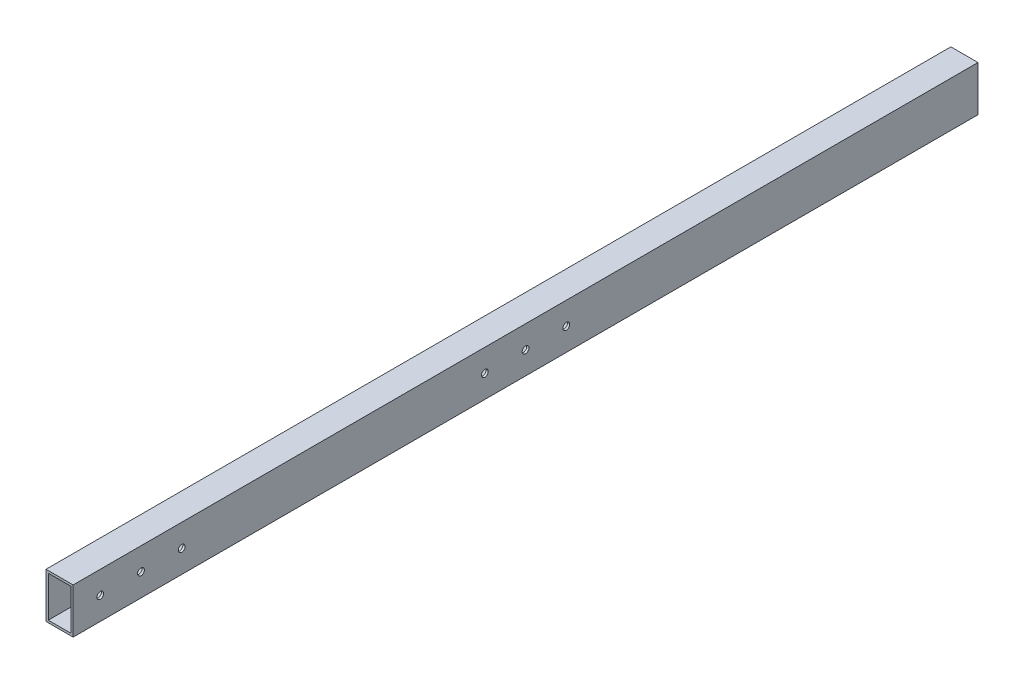
ISO-10303-21;
HEADER;
FILE_DESCRIPTION(('STEP AP214'),'2;1');
FILE_NAME('part.step','',(''),(''),'','','');
FILE_SCHEMA(('AUTOMOTIVE_DESIGN { 1 0 10303 214 1 1 1 1 }'));
ENDSEC;
DATA;
#1=APPLICATION_CONTEXT('core data for automotive mechanical design processes');
#2=APPLICATION_PROTOCOL_DEFINITION('international standard','automotive_design',2000,#1);
#3=PRODUCT_CONTEXT('',#1,'mechanical');
#4=PRODUCT('Part','Part','',(#3));
#5=PRODUCT_RELATED_PRODUCT_CATEGORY('part','',(#4));
#6=PRODUCT_DEFINITION_FORMATION('','',#4);
#7=PRODUCT_DEFINITION_CONTEXT('part definition',#1,'design');
#8=PRODUCT_DEFINITION('design','',#6,#7);
#9=PRODUCT_DEFINITION_SHAPE('','',#8);
#10=(LENGTH_UNIT() NAMED_UNIT(*) SI_UNIT(.MILLI.,.METRE.));
#11=(NAMED_UNIT(*) PLANE_ANGLE_UNIT() SI_UNIT($,.RADIAN.));
#12=(NAMED_UNIT(*) SI_UNIT($,.STERADIAN.) SOLID_ANGLE_UNIT());
#13=UNCERTAINTY_MEASURE_WITH_UNIT(LENGTH_MEASURE(1.E-05),#10,'distance_accuracy_value','');
#14=(GEOMETRIC_REPRESENTATION_CONTEXT(3) GLOBAL_UNCERTAINTY_ASSIGNED_CONTEXT((#13)) GLOBAL_UNIT_ASSIGNED_CONTEXT((#10,
#11,#12)) REPRESENTATION_CONTEXT('',''));
#15=CARTESIAN_POINT('',(0.,0.,0.));
#16=DIRECTION('',(0.,0.,1.));
#17=DIRECTION('',(1.,0.,0.));
#18=AXIS2_PLACEMENT_3D('',#15,#16,#17);
#19=CARTESIAN_POINT('',(0.,0.,400.));
#20=DIRECTION('',(0.,0.,1.));
#21=DIRECTION('',(1.,0.,0.));
#22=AXIS2_PLACEMENT_3D('',#19,#20,#21);
#23=PLANE('',#22);
#24=DIRECTION('',(0.,-1.,0.));
#25=VECTOR('',#24,1.);
#26=CARTESIAN_POINT('',(-6.,-10.,400.));
#27=LINE('',#26,#25);
#28=CARTESIAN_POINT('',(-6.,10.,400.));
#29=VERTEX_POINT('',#28);
#30=CARTESIAN_POINT('',(-6.,-10.,400.));
#31=VERTEX_POINT('',#30);
#32=EDGE_CURVE('E144',#29,#31,#27,.T.);
#33=ORIENTED_EDGE('',*,*,#32,.T.);
#34=DIRECTION('',(1.,0.,0.));
#35=VECTOR('',#34,1.);
#36=CARTESIAN_POINT('',(6.,-10.,400.));
#37=LINE('',#36,#35);
#38=CARTESIAN_POINT('',(6.,-10.,400.));
#39=VERTEX_POINT('',#38);
#40=EDGE_CURVE('E147',#31,#39,#37,.T.);
#41=ORIENTED_EDGE('',*,*,#40,.T.);
#42=DIRECTION('',(0.,1.,0.));
#43=VECTOR('',#42,1.);
#44=CARTESIAN_POINT('',(6.,-10.,400.));
#45=LINE('',#44,#43);
#46=CARTESIAN_POINT('',(6.,10.,400.));
#47=VERTEX_POINT('',#46);
#48=EDGE_CURVE('E150',#39,#47,#45,.T.);
#49=ORIENTED_EDGE('',*,*,#48,.T.);
#50=DIRECTION('',(-1.,0.,0.));
#51=VECTOR('',#50,1.);
#52=CARTESIAN_POINT('',(6.,10.,400.));
#53=LINE('',#52,#51);
#54=EDGE_CURVE('E152',#47,#29,#53,.T.);
#55=ORIENTED_EDGE('',*,*,#54,.T.);
#56=EDGE_LOOP('',(#33,#41,#49,#55));
#57=FACE_BOUND('',#56,.T.);
#58=DIRECTION('',(1.,0.,0.));
#59=VECTOR('',#58,1.);
#60=CARTESIAN_POINT('',(5.,-9.,400.));
#61=LINE('',#60,#59);
#62=CARTESIAN_POINT('',(-5.,-9.,400.));
#63=VERTEX_POINT('',#62);
#64=CARTESIAN_POINT('',(5.,-9.,400.));
#65=VERTEX_POINT('',#64);
#66=EDGE_CURVE('E114',#63,#65,#61,.T.);
#67=ORIENTED_EDGE('',*,*,#66,.F.);
#68=DIRECTION('',(0.,-1.,0.));
#69=VECTOR('',#68,1.);
#70=CARTESIAN_POINT('',(-5.,-9.,400.));
#71=LINE('',#70,#69);
#72=CARTESIAN_POINT('',(-5.,9.,400.));
#73=VERTEX_POINT('',#72);
#74=EDGE_CURVE('E106',#73,#63,#71,.T.);
#75=ORIENTED_EDGE('',*,*,#74,.F.);
#76=DIRECTION('',(-1.,0.,0.));
#77=VECTOR('',#76,1.);
#78=CARTESIAN_POINT('',(5.,9.,400.));
#79=LINE('',#78,#77);
#80=CARTESIAN_POINT('',(5.,9.,400.));
#81=VERTEX_POINT('',#80);
#82=EDGE_CURVE('E128',#81,#73,#79,.T.);
#83=ORIENTED_EDGE('',*,*,#82,.F.);
#84=DIRECTION('',(0.,1.,0.));
#85=VECTOR('',#84,1.);
#86=CARTESIAN_POINT('',(5.,-9.,400.));
#87=LINE('',#86,#85);
#88=EDGE_CURVE('E126',#65,#81,#87,.T.);
#89=ORIENTED_EDGE('',*,*,#88,.F.);
#90=EDGE_LOOP('',(#67,#75,#83,#89));
#91=FACE_BOUND('',#90,.T.);
#92=ADVANCED_FACE('F39',(#57,#91),#23,.T.);
#93=CARTESIAN_POINT('',(0.,0.,0.));
#94=DIRECTION('',(0.,0.,1.));
#95=DIRECTION('',(1.,0.,0.));
#96=AXIS2_PLACEMENT_3D('',#93,#94,#95);
#97=PLANE('',#96);
#98=DIRECTION('',(0.,-1.,0.));
#99=VECTOR('',#98,1.);
#100=CARTESIAN_POINT('',(-6.,-10.,0.));
#101=LINE('',#100,#99);
#102=CARTESIAN_POINT('',(-6.,10.,0.));
#103=VERTEX_POINT('',#102);
#104=CARTESIAN_POINT('',(-6.,-10.,0.));
#105=VERTEX_POINT('',#104);
#106=EDGE_CURVE('E122',#103,#105,#101,.T.);
#107=ORIENTED_EDGE('',*,*,#106,.F.);
#108=DIRECTION('',(-1.,0.,0.));
#109=VECTOR('',#108,1.);
#110=CARTESIAN_POINT('',(6.,10.,0.));
#111=LINE('',#110,#109);
#112=CARTESIAN_POINT('',(6.,10.,0.));
#113=VERTEX_POINT('',#112);
#114=EDGE_CURVE('E148',#113,#103,#111,.T.);
#115=ORIENTED_EDGE('',*,*,#114,.F.);
#116=DIRECTION('',(0.,1.,0.));
#117=VECTOR('',#116,1.);
#118=CARTESIAN_POINT('',(6.,-10.,0.));
#119=LINE('',#118,#117);
#120=CARTESIAN_POINT('',(6.,-10.,0.));
#121=VERTEX_POINT('',#120);
#122=EDGE_CURVE('E159',#121,#113,#119,.T.);
#123=ORIENTED_EDGE('',*,*,#122,.F.);
#124=DIRECTION('',(1.,0.,0.));
#125=VECTOR('',#124,1.);
#126=CARTESIAN_POINT('',(6.,-10.,0.));
#127=LINE('',#126,#125);
#128=EDGE_CURVE('E157',#105,#121,#127,.T.);
#129=ORIENTED_EDGE('',*,*,#128,.F.);
#130=EDGE_LOOP('',(#107,#115,#123,#129));
#131=FACE_BOUND('',#130,.T.);
#132=DIRECTION('',(0.,-1.,0.));
#133=VECTOR('',#132,1.);
#134=CARTESIAN_POINT('',(-5.,-9.,0.));
#135=LINE('',#134,#133);
#136=CARTESIAN_POINT('',(-5.,9.,0.));
#137=VERTEX_POINT('',#136);
#138=CARTESIAN_POINT('',(-5.,-9.,0.));
#139=VERTEX_POINT('',#138);
#140=EDGE_CURVE('E64',#137,#139,#135,.T.);
#141=ORIENTED_EDGE('',*,*,#140,.T.);
#142=DIRECTION('',(1.,0.,0.));
#143=VECTOR('',#142,1.);
#144=CARTESIAN_POINT('',(5.,-9.,0.));
#145=LINE('',#144,#143);
#146=CARTESIAN_POINT('',(5.,-9.,0.));
#147=VERTEX_POINT('',#146);
#148=EDGE_CURVE('E121',#139,#147,#145,.T.);
#149=ORIENTED_EDGE('',*,*,#148,.T.);
#150=DIRECTION('',(0.,1.,0.));
#151=VECTOR('',#150,1.);
#152=CARTESIAN_POINT('',(5.,-9.,0.));
#153=LINE('',#152,#151);
#154=CARTESIAN_POINT('',(5.,9.,0.));
#155=VERTEX_POINT('',#154);
#156=EDGE_CURVE('E136',#147,#155,#153,.T.);
#157=ORIENTED_EDGE('',*,*,#156,.T.);
#158=DIRECTION('',(-1.,0.,0.));
#159=VECTOR('',#158,1.);
#160=CARTESIAN_POINT('',(5.,9.,0.));
#161=LINE('',#160,#159);
#162=EDGE_CURVE('E115',#155,#137,#161,.T.);
#163=ORIENTED_EDGE('',*,*,#162,.T.);
#164=EDGE_LOOP('',(#141,#149,#157,#163));
#165=FACE_BOUND('',#164,.T.);
#166=ADVANCED_FACE('F232',(#131,#165),#97,.F.);
#167=CARTESIAN_POINT('',(-6.,-10.,400.));
#168=DIRECTION('',(1.,0.,0.));
#169=DIRECTION('',(0.,0.,-1.));
#170=AXIS2_PLACEMENT_3D('',#167,#168,#169);
#171=PLANE('',#170);
#172=CARTESIAN_POINT('',(-6.00000000000001,0.,182.));
#173=DIRECTION('',(1.,0.,0.));
#174=DIRECTION('',(0.,0.,-1.));
#175=AXIS2_PLACEMENT_3D('',#172,#173,#174);
#176=CIRCLE('',#175,1.50000000000008);
#177=CARTESIAN_POINT('',(-6.00000000000001,0.,180.5));
#178=VERTEX_POINT('',#177);
#179=EDGE_CURVE('E134',#178,#178,#176,.T.);
#180=ORIENTED_EDGE('',*,*,#179,.T.);
#181=EDGE_LOOP('',(#180));
#182=FACE_BOUND('',#181,.T.);
#183=CARTESIAN_POINT('',(-6.00000000000001,0.,218.));
#184=DIRECTION('',(1.,0.,0.));
#185=DIRECTION('',(0.,0.,-1.));
#186=AXIS2_PLACEMENT_3D('',#183,#184,#185);
#187=CIRCLE('',#186,1.50000000000008);
#188=CARTESIAN_POINT('',(-6.00000000000001,0.,216.5));
#189=VERTEX_POINT('',#188);
#190=EDGE_CURVE('E195',#189,#189,#187,.T.);
#191=ORIENTED_EDGE('',*,*,#190,.T.);
#192=EDGE_LOOP('',(#191));
#193=FACE_BOUND('',#192,.T.);
#194=CARTESIAN_POINT('',(-6.00000000000001,0.,370.));
#195=DIRECTION('',(1.,0.,0.));
#196=DIRECTION('',(0.,0.,-1.));
#197=AXIS2_PLACEMENT_3D('',#194,#195,#196);
#198=CIRCLE('',#197,1.50000000000002);
#199=CARTESIAN_POINT('',(-6.00000000000001,0.,368.5));
#200=VERTEX_POINT('',#199);
#201=EDGE_CURVE('E191',#200,#200,#198,.T.);
#202=ORIENTED_EDGE('',*,*,#201,.T.);
#203=EDGE_LOOP('',(#202));
#204=FACE_BOUND('',#203,.T.);
#205=CARTESIAN_POINT('',(-6.00000000000001,0.,388.));
#206=DIRECTION('',(1.,0.,0.));
#207=DIRECTION('',(0.,0.,-1.));
#208=AXIS2_PLACEMENT_3D('',#205,#206,#207);
#209=CIRCLE('',#208,1.50000000000002);
#210=CARTESIAN_POINT('',(-6.00000000000001,0.,386.5));
#211=VERTEX_POINT('',#210);
#212=EDGE_CURVE('E187',#211,#211,#209,.T.);
#213=ORIENTED_EDGE('',*,*,#212,.T.);
#214=EDGE_LOOP('',(#213));
#215=FACE_BOUND('',#214,.T.);
#216=CARTESIAN_POINT('',(-6.00000000000001,0.,352.));
#217=DIRECTION('',(1.,0.,0.));
#218=DIRECTION('',(0.,0.,-1.));
#219=AXIS2_PLACEMENT_3D('',#216,#217,#218);
#220=CIRCLE('',#219,1.50000000000002);
#221=CARTESIAN_POINT('',(-6.00000000000001,0.,350.5));
#222=VERTEX_POINT('',#221);
#223=EDGE_CURVE('E183',#222,#222,#220,.T.);
#224=ORIENTED_EDGE('',*,*,#223,.T.);
#225=EDGE_LOOP('',(#224));
#226=FACE_BOUND('',#225,.T.);
#227=CARTESIAN_POINT('',(-6.00000000000001,0.,200.));
#228=DIRECTION('',(1.,0.,0.));
#229=DIRECTION('',(0.,0.,-1.));
#230=AXIS2_PLACEMENT_3D('',#227,#228,#229);
#231=CIRCLE('',#230,1.50000000000008);
#232=CARTESIAN_POINT('',(-6.00000000000001,0.,198.5));
#233=VERTEX_POINT('',#232);
#234=EDGE_CURVE('E178',#233,#233,#231,.T.);
#235=ORIENTED_EDGE('',*,*,#234,.T.);
#236=EDGE_LOOP('',(#235));
#237=FACE_BOUND('',#236,.T.);
#238=ORIENTED_EDGE('',*,*,#106,.T.);
#239=DIRECTION('',(0.,0.,-1.));
#240=VECTOR('',#239,1.);
#241=CARTESIAN_POINT('',(-6.,-10.,400.));
#242=LINE('',#241,#240);
#243=EDGE_CURVE('E11',#31,#105,#242,.T.);
#244=ORIENTED_EDGE('',*,*,#243,.F.);
#245=ORIENTED_EDGE('',*,*,#32,.F.);
#246=DIRECTION('',(0.,0.,-1.));
#247=VECTOR('',#246,1.);
#248=CARTESIAN_POINT('',(-6.,10.,400.));
#249=LINE('',#248,#247);
#250=EDGE_CURVE('E154',#29,#103,#249,.T.);
#251=ORIENTED_EDGE('',*,*,#250,.T.);
#252=EDGE_LOOP('',(#238,#244,#245,#251));
#253=FACE_BOUND('',#252,.T.);
#254=ADVANCED_FACE('F41',(#182,#193,#204,#215,#226,#237,#253),#171,.F.);
#255=CARTESIAN_POINT('',(6.,-10.,400.));
#256=DIRECTION('',(0.,1.,0.));
#257=DIRECTION('',(-1.,0.,0.));
#258=AXIS2_PLACEMENT_3D('',#255,#256,#257);
#259=PLANE('',#258);
#260=ORIENTED_EDGE('',*,*,#128,.T.);
#261=DIRECTION('',(0.,0.,-1.));
#262=VECTOR('',#261,1.);
#263=CARTESIAN_POINT('',(6.,-10.,400.));
#264=LINE('',#263,#262);
#265=EDGE_CURVE('E48',#39,#121,#264,.T.);
#266=ORIENTED_EDGE('',*,*,#265,.F.);
#267=ORIENTED_EDGE('',*,*,#40,.F.);
#268=ORIENTED_EDGE('',*,*,#243,.T.);
#269=EDGE_LOOP('',(#260,#266,#267,#268));
#270=FACE_BOUND('',#269,.T.);
#271=ADVANCED_FACE('F249',(#270),#259,.F.);
#272=CARTESIAN_POINT('',(6.,-10.,400.));
#273=DIRECTION('',(-1.,0.,0.));
#274=DIRECTION('',(0.,-1.,0.));
#275=AXIS2_PLACEMENT_3D('',#272,#273,#274);
#276=PLANE('',#275);
#277=CARTESIAN_POINT('',(6.,0.,182.));
#278=DIRECTION('',(1.,0.,0.));
#279=DIRECTION('',(0.,1.,0.));
#280=AXIS2_PLACEMENT_3D('',#277,#278,#279);
#281=CIRCLE('',#280,1.50000000000008);
#282=CARTESIAN_POINT('',(6.,1.50000000000008,182.));
#283=VERTEX_POINT('',#282);
#284=EDGE_CURVE('E358',#283,#283,#281,.T.);
#285=ORIENTED_EDGE('',*,*,#284,.F.);
#286=EDGE_LOOP('',(#285));
#287=FACE_BOUND('',#286,.T.);
#288=CARTESIAN_POINT('',(6.,0.,218.));
#289=DIRECTION('',(1.,0.,0.));
#290=DIRECTION('',(0.,1.,0.));
#291=AXIS2_PLACEMENT_3D('',#288,#289,#290);
#292=CIRCLE('',#291,1.50000000000008);
#293=CARTESIAN_POINT('',(6.,1.50000000000008,218.));
#294=VERTEX_POINT('',#293);
#295=EDGE_CURVE('E351',#294,#294,#292,.T.);
#296=ORIENTED_EDGE('',*,*,#295,.F.);
#297=EDGE_LOOP('',(#296));
#298=FACE_BOUND('',#297,.T.);
#299=CARTESIAN_POINT('',(6.,0.,370.));
#300=DIRECTION('',(1.,0.,0.));
#301=DIRECTION('',(0.,1.,0.));
#302=AXIS2_PLACEMENT_3D('',#299,#300,#301);
#303=CIRCLE('',#302,1.50000000000002);
#304=CARTESIAN_POINT('',(6.,1.50000000000002,370.));
#305=VERTEX_POINT('',#304);
#306=EDGE_CURVE('E348',#305,#305,#303,.T.);
#307=ORIENTED_EDGE('',*,*,#306,.F.);
#308=EDGE_LOOP('',(#307));
#309=FACE_BOUND('',#308,.T.);
#310=CARTESIAN_POINT('',(6.,0.,388.));
#311=DIRECTION('',(1.,0.,0.));
#312=DIRECTION('',(0.,1.,0.));
#313=AXIS2_PLACEMENT_3D('',#310,#311,#312);
#314=CIRCLE('',#313,1.50000000000002);
#315=CARTESIAN_POINT('',(6.,1.50000000000002,388.));
#316=VERTEX_POINT('',#315);
#317=EDGE_CURVE('E346',#316,#316,#314,.T.);
#318=ORIENTED_EDGE('',*,*,#317,.F.);
#319=EDGE_LOOP('',(#318));
#320=FACE_BOUND('',#319,.T.);
#321=CARTESIAN_POINT('',(6.,0.,352.));
#322=DIRECTION('',(1.,0.,0.));
#323=DIRECTION('',(0.,1.,0.));
#324=AXIS2_PLACEMENT_3D('',#321,#322,#323);
#325=CIRCLE('',#324,1.50000000000002);
#326=CARTESIAN_POINT('',(6.,1.50000000000002,352.));
#327=VERTEX_POINT('',#326);
#328=EDGE_CURVE('E349',#327,#327,#325,.T.);
#329=ORIENTED_EDGE('',*,*,#328,.F.);
#330=EDGE_LOOP('',(#329));
#331=FACE_BOUND('',#330,.T.);
#332=CARTESIAN_POINT('',(6.,0.,200.));
#333=DIRECTION('',(1.,0.,0.));
#334=DIRECTION('',(0.,1.,0.));
#335=AXIS2_PLACEMENT_3D('',#332,#333,#334);
#336=CIRCLE('',#335,1.50000000000008);
#337=CARTESIAN_POINT('',(6.,1.50000000000008,200.));
#338=VERTEX_POINT('',#337);
#339=EDGE_CURVE('E173',#338,#338,#336,.T.);
#340=ORIENTED_EDGE('',*,*,#339,.F.);
#341=EDGE_LOOP('',(#340));
#342=FACE_BOUND('',#341,.T.);
#343=ORIENTED_EDGE('',*,*,#122,.T.);
#344=DIRECTION('',(0.,0.,-1.));
#345=VECTOR('',#344,1.);
#346=CARTESIAN_POINT('',(6.,10.,400.));
#347=LINE('',#346,#345);
#348=EDGE_CURVE('E164',#47,#113,#347,.T.);
#349=ORIENTED_EDGE('',*,*,#348,.F.);
#350=ORIENTED_EDGE('',*,*,#48,.F.);
#351=ORIENTED_EDGE('',*,*,#265,.T.);
#352=EDGE_LOOP('',(#343,#349,#350,#351));
#353=FACE_BOUND('',#352,.T.);
#354=ADVANCED_FACE('F246',(#287,#298,#309,#320,#331,#342,#353),#276,.F.);
#355=CARTESIAN_POINT('',(6.,10.,400.));
#356=DIRECTION('',(0.,-1.,0.));
#357=DIRECTION('',(1.,0.,0.));
#358=AXIS2_PLACEMENT_3D('',#355,#356,#357);
#359=PLANE('',#358);
#360=ORIENTED_EDGE('',*,*,#114,.T.);
#361=ORIENTED_EDGE('',*,*,#250,.F.);
#362=ORIENTED_EDGE('',*,*,#54,.F.);
#363=ORIENTED_EDGE('',*,*,#348,.T.);
#364=EDGE_LOOP('',(#360,#361,#362,#363));
#365=FACE_BOUND('',#364,.T.);
#366=ADVANCED_FACE('F243',(#365),#359,.F.);
#367=CARTESIAN_POINT('',(-5.,-9.,400.));
#368=DIRECTION('',(1.,0.,0.));
#369=DIRECTION('',(0.,0.,-1.));
#370=AXIS2_PLACEMENT_3D('',#367,#368,#369);
#371=PLANE('',#370);
#372=CARTESIAN_POINT('',(-5.,0.,182.));
#373=DIRECTION('',(1.,0.,0.));
#374=DIRECTION('',(0.,0.,-1.));
#375=AXIS2_PLACEMENT_3D('',#372,#373,#374);
#376=CIRCLE('',#375,1.50000000000008);
#377=CARTESIAN_POINT('',(-5.,0.,180.5));
#378=VERTEX_POINT('',#377);
#379=EDGE_CURVE('E207',#378,#378,#376,.T.);
#380=ORIENTED_EDGE('',*,*,#379,.F.);
#381=EDGE_LOOP('',(#380));
#382=FACE_BOUND('',#381,.T.);
#383=CARTESIAN_POINT('',(-5.,0.,218.));
#384=DIRECTION('',(1.,0.,0.));
#385=DIRECTION('',(0.,0.,-1.));
#386=AXIS2_PLACEMENT_3D('',#383,#384,#385);
#387=CIRCLE('',#386,1.50000000000008);
#388=CARTESIAN_POINT('',(-5.,0.,216.5));
#389=VERTEX_POINT('',#388);
#390=EDGE_CURVE('E190',#389,#389,#387,.T.);
#391=ORIENTED_EDGE('',*,*,#390,.F.);
#392=EDGE_LOOP('',(#391));
#393=FACE_BOUND('',#392,.T.);
#394=CARTESIAN_POINT('',(-5.,0.,370.));
#395=DIRECTION('',(1.,0.,0.));
#396=DIRECTION('',(0.,0.,-1.));
#397=AXIS2_PLACEMENT_3D('',#394,#395,#396);
#398=CIRCLE('',#397,1.50000000000002);
#399=CARTESIAN_POINT('',(-5.,0.,368.5));
#400=VERTEX_POINT('',#399);
#401=EDGE_CURVE('E186',#400,#400,#398,.T.);
#402=ORIENTED_EDGE('',*,*,#401,.F.);
#403=EDGE_LOOP('',(#402));
#404=FACE_BOUND('',#403,.T.);
#405=CARTESIAN_POINT('',(-5.,0.,388.));
#406=DIRECTION('',(1.,0.,0.));
#407=DIRECTION('',(0.,0.,-1.));
#408=AXIS2_PLACEMENT_3D('',#405,#406,#407);
#409=CIRCLE('',#408,1.50000000000002);
#410=CARTESIAN_POINT('',(-5.,0.,386.5));
#411=VERTEX_POINT('',#410);
#412=EDGE_CURVE('E182',#411,#411,#409,.T.);
#413=ORIENTED_EDGE('',*,*,#412,.F.);
#414=EDGE_LOOP('',(#413));
#415=FACE_BOUND('',#414,.T.);
#416=CARTESIAN_POINT('',(-5.,0.,352.));
#417=DIRECTION('',(1.,0.,0.));
#418=DIRECTION('',(0.,0.,-1.));
#419=AXIS2_PLACEMENT_3D('',#416,#417,#418);
#420=CIRCLE('',#419,1.50000000000002);
#421=CARTESIAN_POINT('',(-5.,0.,350.5));
#422=VERTEX_POINT('',#421);
#423=EDGE_CURVE('E177',#422,#422,#420,.T.);
#424=ORIENTED_EDGE('',*,*,#423,.F.);
#425=EDGE_LOOP('',(#424));
#426=FACE_BOUND('',#425,.T.);
#427=CARTESIAN_POINT('',(-5.,0.,200.));
#428=DIRECTION('',(1.,0.,0.));
#429=DIRECTION('',(0.,0.,-1.));
#430=AXIS2_PLACEMENT_3D('',#427,#428,#429);
#431=CIRCLE('',#430,1.50000000000008);
#432=CARTESIAN_POINT('',(-5.,0.,198.5));
#433=VERTEX_POINT('',#432);
#434=EDGE_CURVE('E172',#433,#433,#431,.T.);
#435=ORIENTED_EDGE('',*,*,#434,.F.);
#436=EDGE_LOOP('',(#435));
#437=FACE_BOUND('',#436,.T.);
#438=ORIENTED_EDGE('',*,*,#140,.F.);
#439=DIRECTION('',(0.,0.,-1.));
#440=VECTOR('',#439,1.);
#441=CARTESIAN_POINT('',(-5.,9.,400.));
#442=LINE('',#441,#440);
#443=EDGE_CURVE('E110',#73,#137,#442,.T.);
#444=ORIENTED_EDGE('',*,*,#443,.F.);
#445=ORIENTED_EDGE('',*,*,#74,.T.);
#446=DIRECTION('',(0.,0.,-1.));
#447=VECTOR('',#446,1.);
#448=CARTESIAN_POINT('',(-5.,-9.,400.));
#449=LINE('',#448,#447);
#450=EDGE_CURVE('E109',#63,#139,#449,.T.);
#451=ORIENTED_EDGE('',*,*,#450,.T.);
#452=EDGE_LOOP('',(#438,#444,#445,#451));
#453=FACE_BOUND('',#452,.T.);
#454=ADVANCED_FACE('F108',(#382,#393,#404,#415,#426,#437,#453),#371,.T.);
#455=CARTESIAN_POINT('',(5.,-9.,400.));
#456=DIRECTION('',(0.,1.,0.));
#457=DIRECTION('',(0.,0.,1.));
#458=AXIS2_PLACEMENT_3D('',#455,#456,#457);
#459=PLANE('',#458);
#460=ORIENTED_EDGE('',*,*,#148,.F.);
#461=ORIENTED_EDGE('',*,*,#450,.F.);
#462=ORIENTED_EDGE('',*,*,#66,.T.);
#463=DIRECTION('',(0.,0.,-1.));
#464=VECTOR('',#463,1.);
#465=CARTESIAN_POINT('',(5.,-9.,400.));
#466=LINE('',#465,#464);
#467=EDGE_CURVE('E123',#65,#147,#466,.T.);
#468=ORIENTED_EDGE('',*,*,#467,.T.);
#469=EDGE_LOOP('',(#460,#461,#462,#468));
#470=FACE_BOUND('',#469,.T.);
#471=ADVANCED_FACE('F118',(#470),#459,.T.);
#472=CARTESIAN_POINT('',(5.,-9.,400.));
#473=DIRECTION('',(-1.,0.,0.));
#474=DIRECTION('',(0.,0.,1.));
#475=AXIS2_PLACEMENT_3D('',#472,#473,#474);
#476=PLANE('',#475);
#477=CARTESIAN_POINT('',(5.,0.,182.));
#478=DIRECTION('',(-1.,0.,0.));
#479=DIRECTION('',(0.,0.,1.));
#480=AXIS2_PLACEMENT_3D('',#477,#478,#479);
#481=CIRCLE('',#480,1.50000000000008);
#482=CARTESIAN_POINT('',(5.,0.,183.5));
#483=VERTEX_POINT('',#482);
#484=EDGE_CURVE('E43',#483,#483,#481,.T.);
#485=ORIENTED_EDGE('',*,*,#484,.F.);
#486=EDGE_LOOP('',(#485));
#487=FACE_BOUND('',#486,.T.);
#488=CARTESIAN_POINT('',(5.,0.,218.));
#489=DIRECTION('',(-1.,0.,0.));
#490=DIRECTION('',(0.,0.,1.));
#491=AXIS2_PLACEMENT_3D('',#488,#489,#490);
#492=CIRCLE('',#491,1.50000000000008);
#493=CARTESIAN_POINT('',(5.,0.,219.5));
#494=VERTEX_POINT('',#493);
#495=EDGE_CURVE('E188',#494,#494,#492,.T.);
#496=ORIENTED_EDGE('',*,*,#495,.F.);
#497=EDGE_LOOP('',(#496));
#498=FACE_BOUND('',#497,.T.);
#499=CARTESIAN_POINT('',(5.,0.,370.));
#500=DIRECTION('',(-1.,0.,0.));
#501=DIRECTION('',(0.,0.,1.));
#502=AXIS2_PLACEMENT_3D('',#499,#500,#501);
#503=CIRCLE('',#502,1.50000000000002);
#504=CARTESIAN_POINT('',(5.,0.,371.5));
#505=VERTEX_POINT('',#504);
#506=EDGE_CURVE('E184',#505,#505,#503,.T.);
#507=ORIENTED_EDGE('',*,*,#506,.F.);
#508=EDGE_LOOP('',(#507));
#509=FACE_BOUND('',#508,.T.);
#510=CARTESIAN_POINT('',(5.,0.,388.));
#511=DIRECTION('',(-1.,0.,0.));
#512=DIRECTION('',(0.,0.,1.));
#513=AXIS2_PLACEMENT_3D('',#510,#511,#512);
#514=CIRCLE('',#513,1.50000000000002);
#515=CARTESIAN_POINT('',(5.,0.,389.5));
#516=VERTEX_POINT('',#515);
#517=EDGE_CURVE('E179',#516,#516,#514,.T.);
#518=ORIENTED_EDGE('',*,*,#517,.F.);
#519=EDGE_LOOP('',(#518));
#520=FACE_BOUND('',#519,.T.);
#521=CARTESIAN_POINT('',(5.,0.,352.));
#522=DIRECTION('',(-1.,0.,0.));
#523=DIRECTION('',(0.,0.,1.));
#524=AXIS2_PLACEMENT_3D('',#521,#522,#523);
#525=CIRCLE('',#524,1.50000000000002);
#526=CARTESIAN_POINT('',(5.,0.,353.5));
#527=VERTEX_POINT('',#526);
#528=EDGE_CURVE('E174',#527,#527,#525,.T.);
#529=ORIENTED_EDGE('',*,*,#528,.F.);
#530=EDGE_LOOP('',(#529));
#531=FACE_BOUND('',#530,.T.);
#532=CARTESIAN_POINT('',(5.,0.,200.));
#533=DIRECTION('',(-1.,0.,0.));
#534=DIRECTION('',(0.,0.,1.));
#535=AXIS2_PLACEMENT_3D('',#532,#533,#534);
#536=CIRCLE('',#535,1.50000000000008);
#537=CARTESIAN_POINT('',(5.,0.,201.5));
#538=VERTEX_POINT('',#537);
#539=EDGE_CURVE('E169',#538,#538,#536,.T.);
#540=ORIENTED_EDGE('',*,*,#539,.F.);
#541=EDGE_LOOP('',(#540));
#542=FACE_BOUND('',#541,.T.);
#543=ORIENTED_EDGE('',*,*,#156,.F.);
#544=ORIENTED_EDGE('',*,*,#467,.F.);
#545=ORIENTED_EDGE('',*,*,#88,.T.);
#546=DIRECTION('',(0.,0.,-1.));
#547=VECTOR('',#546,1.);
#548=CARTESIAN_POINT('',(5.,9.,400.));
#549=LINE('',#548,#547);
#550=EDGE_CURVE('E56',#81,#155,#549,.T.);
#551=ORIENTED_EDGE('',*,*,#550,.T.);
#552=EDGE_LOOP('',(#543,#544,#545,#551));
#553=FACE_BOUND('',#552,.T.);
#554=ADVANCED_FACE('F273',(#487,#498,#509,#520,#531,#542,#553),#476,.T.);
#555=CARTESIAN_POINT('',(5.,9.,400.));
#556=DIRECTION('',(0.,-1.,0.));
#557=DIRECTION('',(0.,0.,-1.));
#558=AXIS2_PLACEMENT_3D('',#555,#556,#557);
#559=PLANE('',#558);
#560=ORIENTED_EDGE('',*,*,#162,.F.);
#561=ORIENTED_EDGE('',*,*,#550,.F.);
#562=ORIENTED_EDGE('',*,*,#82,.T.);
#563=ORIENTED_EDGE('',*,*,#443,.T.);
#564=EDGE_LOOP('',(#560,#561,#562,#563));
#565=FACE_BOUND('',#564,.T.);
#566=ADVANCED_FACE('F270',(#565),#559,.T.);
#567=CARTESIAN_POINT('',(-194.,0.,200.));
#568=DIRECTION('',(1.,0.,0.));
#569=DIRECTION('',(0.,1.,0.));
#570=AXIS2_PLACEMENT_3D('',#567,#568,#569);
#571=CYLINDRICAL_SURFACE('',#570,1.50000000000008);
#572=ORIENTED_EDGE('',*,*,#539,.T.);
#573=EDGE_LOOP('',(#572));
#574=FACE_BOUND('',#573,.T.);
#575=ORIENTED_EDGE('',*,*,#339,.T.);
#576=EDGE_LOOP('',(#575));
#577=FACE_BOUND('',#576,.T.);
#578=ADVANCED_FACE('F272',(#574,#577),#571,.F.);
#579=CARTESIAN_POINT('',(-194.,0.,352.));
#580=DIRECTION('',(1.,0.,0.));
#581=DIRECTION('',(0.,1.,0.));
#582=AXIS2_PLACEMENT_3D('',#579,#580,#581);
#583=CYLINDRICAL_SURFACE('',#582,1.50000000000002);
#584=ORIENTED_EDGE('',*,*,#528,.T.);
#585=EDGE_LOOP('',(#584));
#586=FACE_BOUND('',#585,.T.);
#587=ORIENTED_EDGE('',*,*,#328,.T.);
#588=EDGE_LOOP('',(#587));
#589=FACE_BOUND('',#588,.T.);
#590=ADVANCED_FACE('F279',(#586,#589),#583,.F.);
#591=CARTESIAN_POINT('',(-194.,0.,388.));
#592=DIRECTION('',(1.,0.,0.));
#593=DIRECTION('',(0.,1.,0.));
#594=AXIS2_PLACEMENT_3D('',#591,#592,#593);
#595=CYLINDRICAL_SURFACE('',#594,1.50000000000002);
#596=ORIENTED_EDGE('',*,*,#517,.T.);
#597=EDGE_LOOP('',(#596));
#598=FACE_BOUND('',#597,.T.);
#599=ORIENTED_EDGE('',*,*,#317,.T.);
#600=EDGE_LOOP('',(#599));
#601=FACE_BOUND('',#600,.T.);
#602=ADVANCED_FACE('F325',(#598,#601),#595,.F.);
#603=CARTESIAN_POINT('',(-194.,0.,370.));
#604=DIRECTION('',(1.,0.,0.));
#605=DIRECTION('',(0.,1.,0.));
#606=AXIS2_PLACEMENT_3D('',#603,#604,#605);
#607=CYLINDRICAL_SURFACE('',#606,1.50000000000002);
#608=ORIENTED_EDGE('',*,*,#506,.T.);
#609=EDGE_LOOP('',(#608));
#610=FACE_BOUND('',#609,.T.);
#611=ORIENTED_EDGE('',*,*,#306,.T.);
#612=EDGE_LOOP('',(#611));
#613=FACE_BOUND('',#612,.T.);
#614=ADVANCED_FACE('F332',(#610,#613),#607,.F.);
#615=CARTESIAN_POINT('',(-194.,0.,218.));
#616=DIRECTION('',(1.,0.,0.));
#617=DIRECTION('',(0.,1.,0.));
#618=AXIS2_PLACEMENT_3D('',#615,#616,#617);
#619=CYLINDRICAL_SURFACE('',#618,1.50000000000008);
#620=ORIENTED_EDGE('',*,*,#495,.T.);
#621=EDGE_LOOP('',(#620));
#622=FACE_BOUND('',#621,.T.);
#623=ORIENTED_EDGE('',*,*,#295,.T.);
#624=EDGE_LOOP('',(#623));
#625=FACE_BOUND('',#624,.T.);
#626=ADVANCED_FACE('F226',(#622,#625),#619,.F.);
#627=CARTESIAN_POINT('',(-194.,0.,182.));
#628=DIRECTION('',(1.,0.,0.));
#629=DIRECTION('',(0.,1.,0.));
#630=AXIS2_PLACEMENT_3D('',#627,#628,#629);
#631=CYLINDRICAL_SURFACE('',#630,1.50000000000008);
#632=ORIENTED_EDGE('',*,*,#484,.T.);
#633=EDGE_LOOP('',(#632));
#634=FACE_BOUND('',#633,.T.);
#635=ORIENTED_EDGE('',*,*,#284,.T.);
#636=EDGE_LOOP('',(#635));
#637=FACE_BOUND('',#636,.T.);
#638=ADVANCED_FACE('F219',(#634,#637),#631,.F.);
#639=ORIENTED_EDGE('',*,*,#434,.T.);
#640=EDGE_LOOP('',(#639));
#641=FACE_BOUND('',#640,.T.);
#642=ORIENTED_EDGE('',*,*,#234,.F.);
#643=EDGE_LOOP('',(#642));
#644=FACE_BOUND('',#643,.T.);
#645=ADVANCED_FACE('F229',(#641,#644),#571,.F.);
#646=ORIENTED_EDGE('',*,*,#423,.T.);
#647=EDGE_LOOP('',(#646));
#648=FACE_BOUND('',#647,.T.);
#649=ORIENTED_EDGE('',*,*,#223,.F.);
#650=EDGE_LOOP('',(#649));
#651=FACE_BOUND('',#650,.T.);
#652=ADVANCED_FACE('F323',(#648,#651),#583,.F.);
#653=ORIENTED_EDGE('',*,*,#412,.T.);
#654=EDGE_LOOP('',(#653));
#655=FACE_BOUND('',#654,.T.);
#656=ORIENTED_EDGE('',*,*,#212,.F.);
#657=EDGE_LOOP('',(#656));
#658=FACE_BOUND('',#657,.T.);
#659=ADVANCED_FACE('F321',(#655,#658),#595,.F.);
#660=ORIENTED_EDGE('',*,*,#401,.T.);
#661=EDGE_LOOP('',(#660));
#662=FACE_BOUND('',#661,.T.);
#663=ORIENTED_EDGE('',*,*,#201,.F.);
#664=EDGE_LOOP('',(#663));
#665=FACE_BOUND('',#664,.T.);
#666=ADVANCED_FACE('F223',(#662,#665),#607,.F.);
#667=ORIENTED_EDGE('',*,*,#390,.T.);
#668=EDGE_LOOP('',(#667));
#669=FACE_BOUND('',#668,.T.);
#670=ORIENTED_EDGE('',*,*,#190,.F.);
#671=EDGE_LOOP('',(#670));
#672=FACE_BOUND('',#671,.T.);
#673=ADVANCED_FACE('F216',(#669,#672),#619,.F.);
#674=ORIENTED_EDGE('',*,*,#379,.T.);
#675=EDGE_LOOP('',(#674));
#676=FACE_BOUND('',#675,.T.);
#677=ORIENTED_EDGE('',*,*,#179,.F.);
#678=EDGE_LOOP('',(#677));
#679=FACE_BOUND('',#678,.T.);
#680=ADVANCED_FACE('F214',(#676,#679),#631,.F.);
#681=CLOSED_SHELL('',(#92,#166,#254,#271,#354,#366,#454,#471,#554,#566,#578,#590,#602,#614,#626,
#638,#645,#652,#659,#666,#673,#680));
#682=MANIFOLD_SOLID_BREP('B2',#681);
#683=ADVANCED_BREP_SHAPE_REPRESENTATION('',(#18,#682),#14);
#684=SHAPE_DEFINITION_REPRESENTATION(#9,#683);
ENDSEC;
END-ISO-10303-21;
